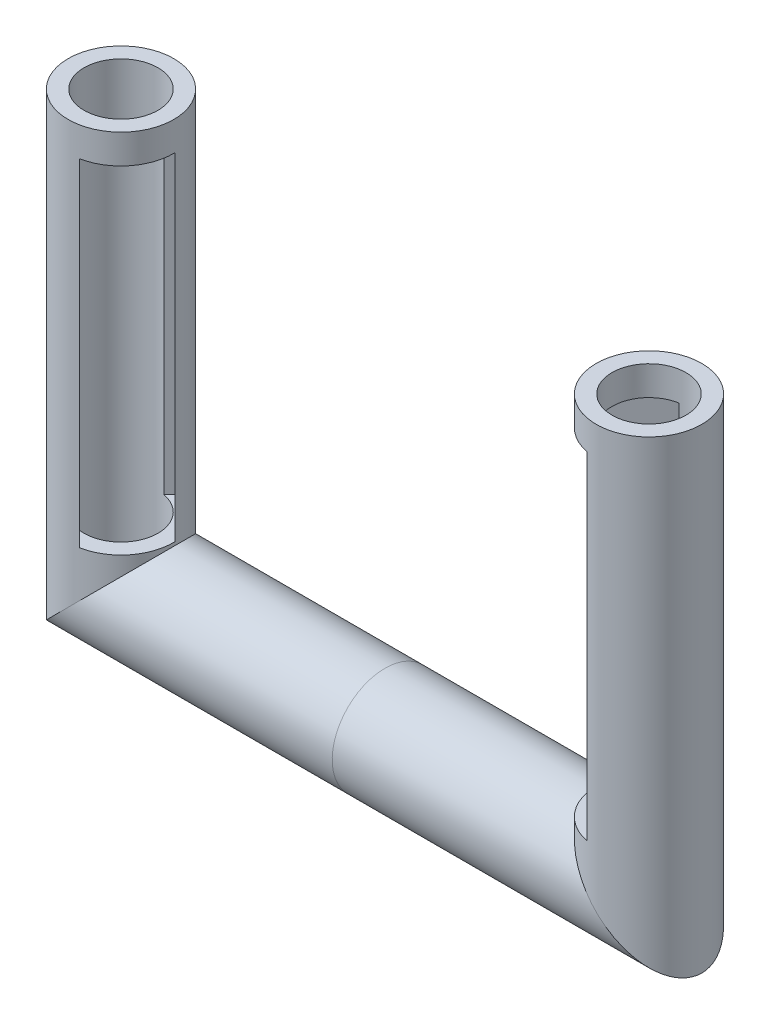
ISO-10303-21;
HEADER;
FILE_DESCRIPTION(('STEP AP214'),'2;1');
FILE_NAME('part.step','',(''),(''),'','','');
FILE_SCHEMA(('AUTOMOTIVE_DESIGN { 1 0 10303 214 1 1 1 1 }'));
ENDSEC;
DATA;
#1=APPLICATION_CONTEXT('core data for automotive mechanical design processes');
#2=APPLICATION_PROTOCOL_DEFINITION('international standard','automotive_design',2000,#1);
#3=PRODUCT_CONTEXT('',#1,'mechanical');
#4=PRODUCT('Part','Part','',(#3));
#5=PRODUCT_RELATED_PRODUCT_CATEGORY('part','',(#4));
#6=PRODUCT_DEFINITION_FORMATION('','',#4);
#7=PRODUCT_DEFINITION_CONTEXT('part definition',#1,'design');
#8=PRODUCT_DEFINITION('design','',#6,#7);
#9=PRODUCT_DEFINITION_SHAPE('','',#8);
#10=(LENGTH_UNIT() NAMED_UNIT(*) SI_UNIT(.MILLI.,.METRE.));
#11=(NAMED_UNIT(*) PLANE_ANGLE_UNIT() SI_UNIT($,.RADIAN.));
#12=(NAMED_UNIT(*) SI_UNIT($,.STERADIAN.) SOLID_ANGLE_UNIT());
#13=UNCERTAINTY_MEASURE_WITH_UNIT(LENGTH_MEASURE(1.E-05),#10,'distance_accuracy_value','');
#14=(GEOMETRIC_REPRESENTATION_CONTEXT(3) GLOBAL_UNCERTAINTY_ASSIGNED_CONTEXT((#13)) GLOBAL_UNIT_ASSIGNED_CONTEXT((#10,
#11,#12)) REPRESENTATION_CONTEXT('',''));
#15=CARTESIAN_POINT('',(0.,0.,0.));
#16=DIRECTION('',(0.,0.,1.));
#17=DIRECTION('',(1.,0.,0.));
#18=AXIS2_PLACEMENT_3D('',#15,#16,#17);
#19=CARTESIAN_POINT('',(25.,0.,0.));
#20=DIRECTION('',(0.,-1.,0.));
#21=DIRECTION('',(0.,0.,-1.));
#22=AXIS2_PLACEMENT_3D('',#19,#20,#21);
#23=CYLINDRICAL_SURFACE('',#22,5.);
#24=CARTESIAN_POINT('',(25.,0.,0.));
#25=DIRECTION('',(0.,-1.,0.));
#26=DIRECTION('',(0.,0.,-1.));
#27=AXIS2_PLACEMENT_3D('',#24,#25,#26);
#28=CIRCLE('',#27,5.);
#29=CARTESIAN_POINT('',(25.,0.,-5.));
#30=VERTEX_POINT('',#29);
#31=EDGE_CURVE('E207',#30,#30,#28,.T.);
#32=ORIENTED_EDGE('',*,*,#31,.T.);
#33=EDGE_LOOP('',(#32));
#34=FACE_BOUND('',#33,.T.);
#35=CARTESIAN_POINT('',(25.,-40.,0.));
#36=DIRECTION('',(-0.707106781186547,-0.707106781186547,0.));
#37=DIRECTION('',(0.707106781186548,-0.707106781186548,0.));
#38=AXIS2_PLACEMENT_3D('',#35,#36,#37);
#39=ELLIPSE('',#38,7.07106781186548,5.);
#40=CARTESIAN_POINT('',(30.,-45.,0.));
#41=VERTEX_POINT('',#40);
#42=EDGE_CURVE('E210',#41,#41,#39,.F.);
#43=ORIENTED_EDGE('',*,*,#42,.T.);
#44=EDGE_LOOP('',(#43));
#45=FACE_BOUND('',#44,.T.);
#46=DIRECTION('',(0.,-1.,0.));
#47=VECTOR('',#46,1.);
#48=CARTESIAN_POINT('',(24.0147215132596,0.,4.9019614751206));
#49=LINE('',#48,#47);
#50=CARTESIAN_POINT('',(24.0147215132596,-2.77855808400567,4.9019614751206));
#51=VERTEX_POINT('',#50);
#52=CARTESIAN_POINT('',(24.0147215132596,-34.6836136026809,4.9019614751206));
#53=VERTEX_POINT('',#52);
#54=EDGE_CURVE('E171',#51,#53,#49,.T.);
#55=ORIENTED_EDGE('',*,*,#54,.T.);
#56=CARTESIAN_POINT('',(25.,-34.6836136026809,0.));
#57=DIRECTION('',(0.,1.,0.));
#58=DIRECTION('',(0.,0.,1.));
#59=AXIS2_PLACEMENT_3D('',#56,#57,#58);
#60=CIRCLE('',#59,5.);
#61=CARTESIAN_POINT('',(20.0016396636706,-34.6836136026809,-0.128038854295883));
#62=VERTEX_POINT('',#61);
#63=EDGE_CURVE('E165',#53,#62,#60,.F.);
#64=ORIENTED_EDGE('',*,*,#63,.T.);
#65=DIRECTION('',(0.,-1.,0.));
#66=VECTOR('',#65,1.);
#67=CARTESIAN_POINT('',(20.0016396636706,0.,-0.128038854295886));
#68=LINE('',#67,#66);
#69=CARTESIAN_POINT('',(20.0016396636706,-2.77855808400567,-0.128038854295886));
#70=VERTEX_POINT('',#69);
#71=EDGE_CURVE('E12',#62,#70,#68,.F.);
#72=ORIENTED_EDGE('',*,*,#71,.T.);
#73=CARTESIAN_POINT('',(25.,-2.77855808400567,0.));
#74=DIRECTION('',(0.,-1.,0.));
#75=DIRECTION('',(0.,0.,-1.));
#76=AXIS2_PLACEMENT_3D('',#73,#74,#75);
#77=CIRCLE('',#76,5.);
#78=EDGE_CURVE('E155',#70,#51,#77,.F.);
#79=ORIENTED_EDGE('',*,*,#78,.T.);
#80=EDGE_LOOP('',(#55,#64,#72,#79));
#81=FACE_BOUND('',#80,.T.);
#82=ADVANCED_FACE('F53',(#34,#45,#81),#23,.T.);
#83=CARTESIAN_POINT('',(25.,-45.,0.));
#84=DIRECTION('',(0.,1.,0.));
#85=DIRECTION('',(-1.,0.,0.));
#86=AXIS2_PLACEMENT_3D('',#83,#84,#85);
#87=CYLINDRICAL_SURFACE('',#86,3.5);
#88=CARTESIAN_POINT('',(25.,0.,0.));
#89=DIRECTION('',(0.,1.,0.));
#90=DIRECTION('',(-1.,0.,0.));
#91=AXIS2_PLACEMENT_3D('',#88,#89,#90);
#92=CIRCLE('',#91,3.5);
#93=CARTESIAN_POINT('',(21.5,0.,0.));
#94=VERTEX_POINT('',#93);
#95=EDGE_CURVE('E200',#94,#94,#92,.T.);
#96=ORIENTED_EDGE('',*,*,#95,.T.);
#97=EDGE_LOOP('',(#96));
#98=FACE_BOUND('',#97,.T.);
#99=CARTESIAN_POINT('',(21.5,-45.,0.));
#100=CARTESIAN_POINT('',(21.4999995512338,-45.000000426217,-0.0870043522183524));
#101=CARTESIAN_POINT('',(21.5032484669496,-44.9977244704508,-0.174003012834708));
#102=CARTESIAN_POINT('',(21.5161907840674,-44.9886777030169,-0.347314194586727));
#103=CARTESIAN_POINT('',(21.5258864338965,-44.9819053231328,-0.433626465698281));
#104=CARTESIAN_POINT('',(21.5515713311856,-44.964028066774,-0.604838270775727));
#105=CARTESIAN_POINT('',(21.5675594869656,-44.952923941812,-0.689738047132314));
#106=CARTESIAN_POINT('',(21.6055872367174,-44.9266471854865,-0.857541615637309));
#107=CARTESIAN_POINT('',(21.6276294204598,-44.911472813032,-0.940444537032612));
#108=CARTESIAN_POINT('',(21.7021474691299,-44.8605038471595,-1.18445169780014));
#109=CARTESIAN_POINT('',(21.7631741569996,-44.8191497819812,-1.34188511202347));
#110=CARTESIAN_POINT('',(21.9053220822461,-44.7248504210069,-1.64342226800416));
#111=CARTESIAN_POINT('',(21.9864462520317,-44.6719034338271,-1.78752406033636));
#112=CARTESIAN_POINT('',(22.174207793629,-44.5529499967267,-2.07281883599129));
#113=CARTESIAN_POINT('',(22.2824657229564,-44.4862031325513,-2.21263077144972));
#114=CARTESIAN_POINT('',(22.5174359567967,-44.3478798670341,-2.47340994772193));
#115=CARTESIAN_POINT('',(22.6441758816401,-44.2762963250093,-2.59434841313184));
#116=CARTESIAN_POINT('',(22.8586794554901,-44.1630190643741,-2.77043321825859));
#117=CARTESIAN_POINT('',(22.9410183065317,-44.1211481424898,-2.83217300660939));
#118=CARTESIAN_POINT('',(23.1112753935954,-44.0387774104055,-2.94845109279402));
#119=CARTESIAN_POINT('',(23.1991950684113,-43.9982779579452,-3.00298752227158));
#120=CARTESIAN_POINT('',(23.4708790990424,-43.8809184938185,-3.15511672851824));
#121=CARTESIAN_POINT('',(23.6629944002236,-43.8079594487069,-3.24158145123197));
#122=CARTESIAN_POINT('',(24.0033854941969,-43.704838124837,-3.3583150253545));
#123=CARTESIAN_POINT('',(24.146667143814,-43.6684243417377,-3.39769929206986));
#124=CARTESIAN_POINT('',(24.4400217225125,-43.6115102670573,-3.45814142842493));
#125=CARTESIAN_POINT('',(24.5900807464653,-43.5909788310104,-3.47923517471286));
#126=CARTESIAN_POINT('',(24.8939955145555,-43.5690614827563,-3.50172630314739));
#127=CARTESIAN_POINT('',(25.0478680235262,-43.567785357308,-3.50301074075767));
#128=CARTESIAN_POINT('',(25.3533930589766,-43.5849071692273,-3.48547905206289));
#129=CARTESIAN_POINT('',(25.5050439858859,-43.6033186380017,-3.46664910102171));
#130=CARTESIAN_POINT('',(25.7918279973207,-43.6549042274352,-3.41217455094726));
#131=CARTESIAN_POINT('',(25.9273906029598,-43.6870234934446,-3.37772210034564));
#132=CARTESIAN_POINT('',(26.1907872983941,-43.7619145236116,-3.29410841442847));
#133=CARTESIAN_POINT('',(26.3186150929751,-43.8046948234213,-3.24493538684719));
#134=CARTESIAN_POINT('',(26.631130358571,-43.9217035825872,-3.10362288773558));
#135=CARTESIAN_POINT('',(26.8100457001008,-44.0005824158214,-3.00252401271627));
#136=CARTESIAN_POINT('',(27.1463248499358,-44.1635383519879,-2.77217358887505));
#137=CARTESIAN_POINT('',(27.3036437533954,-44.2476257738276,-2.64286478640501));
#138=CARTESIAN_POINT('',(27.5963414773844,-44.4131971999364,-2.35615009551438));
#139=CARTESIAN_POINT('',(27.731436868213,-44.4946383043019,-2.19842810008499));
#140=CARTESIAN_POINT('',(27.9734716247704,-44.6457107485664,-1.8579273762317));
#141=CARTESIAN_POINT('',(28.0804693567948,-44.7153664609856,-1.67520180814532));
#142=CARTESIAN_POINT('',(28.2413004145221,-44.8221663191169,-1.33103347938956));
#143=CARTESIAN_POINT('',(28.3016573477555,-44.8630935104224,-1.17381323782198));
#144=CARTESIAN_POINT('',(28.3995844313413,-44.9301001158466,-0.849391818622386));
#145=CARTESIAN_POINT('',(28.4371701020425,-44.9561896422184,-0.682197524634615));
#146=CARTESIAN_POINT('',(28.4875563004228,-44.9912640881203,-0.34160158230725));
#147=CARTESIAN_POINT('',(28.5002562644933,-45.0001796047066,-0.168177620339824));
#148=CARTESIAN_POINT('',(28.4997359535083,-44.9998149479061,0.178615477776586));
#149=CARTESIAN_POINT('',(28.4865168495561,-44.9905355966193,0.35198461604868));
#150=CARTESIAN_POINT('',(28.436722828532,-44.9558830824629,0.681878691052441));
#151=CARTESIAN_POINT('',(28.4017283336819,-44.9315996684455,0.838764541823677));
#152=CARTESIAN_POINT('',(28.3116266993323,-44.8698867392557,1.14387617411518));
#153=CARTESIAN_POINT('',(28.2565158080886,-44.8324547719037,1.29210033422852));
#154=CARTESIAN_POINT('',(28.1238414855766,-44.7440240710528,1.58733800015477));
#155=CARTESIAN_POINT('',(28.0449662780166,-44.6922533534956,1.7335252380801));
#156=CARTESIAN_POINT('',(27.8692594588007,-44.5801824682401,2.0110620530274));
#157=CARTESIAN_POINT('',(27.7724165610341,-44.519876945222,2.14240222019462));
#158=CARTESIAN_POINT('',(27.544939582541,-44.3837210249878,2.41023390883475));
#159=CARTESIAN_POINT('',(27.4113590265687,-44.3069755936636,2.54376778669948));
#160=CARTESIAN_POINT('',(27.1245427915274,-44.1531901996123,2.78779809474485));
#161=CARTESIAN_POINT('',(26.9712916916136,-44.0761500523102,2.8982762699034));
#162=CARTESIAN_POINT('',(26.6619774699135,-43.9363684782576,3.08500748122271));
#163=CARTESIAN_POINT('',(26.5075874323328,-43.8729642412897,3.1635242228457));
#164=CARTESIAN_POINT('',(26.1848447704579,-43.7591514944573,3.29796239328923));
#165=CARTESIAN_POINT('',(26.0165202138254,-43.7087176621485,3.35392797233398));
#166=CARTESIAN_POINT('',(25.7037654302806,-43.6369060024393,3.43149310287235));
#167=CARTESIAN_POINT('',(25.5613897573647,-43.6117142338086,3.45775440021168));
#168=CARTESIAN_POINT('',(25.2725865776338,-43.5782451738799,3.4923883051313));
#169=CARTESIAN_POINT('',(25.1261645726003,-43.5699459600266,3.50078409856961));
#170=CARTESIAN_POINT('',(24.8333598190396,-43.5715971669588,3.49909888334034));
#171=CARTESIAN_POINT('',(24.6869773288251,-43.5815695159632,3.48899567350594));
#172=CARTESIAN_POINT('',(24.398596490882,-43.6181648508262,3.45102053266417));
#173=CARTESIAN_POINT('',(24.2566048636507,-43.6448121516813,3.42312265276601));
#174=CARTESIAN_POINT('',(23.9409542040506,-43.7204664688759,3.34096227925005));
#175=CARTESIAN_POINT('',(23.7696829271032,-43.7736637811444,3.28147777563187));
#176=CARTESIAN_POINT('',(23.4419536090312,-43.8928197910686,3.13919427182786));
#177=CARTESIAN_POINT('',(23.28551909772,-43.9587982706025,3.0563590392188));
#178=CARTESIAN_POINT('',(22.984989333815,-44.0978200574564,2.8673990402521));
#179=CARTESIAN_POINT('',(22.8412761578677,-44.170994093468,2.76076710805705));
#180=CARTESIAN_POINT('',(22.5714511201449,-44.3168248864212,2.52666411670163));
#181=CARTESIAN_POINT('',(22.4453451056674,-44.38948146395,2.39918616499751));
#182=CARTESIAN_POINT('',(22.2602189874005,-44.5003763783351,2.18058687186094));
#183=CARTESIAN_POINT('',(22.1947947449777,-44.5405801571647,2.09580486228961));
#184=CARTESIAN_POINT('',(22.0714222057056,-44.617818614542,1.9196318449831));
#185=CARTESIAN_POINT('',(22.01347069167,-44.6548546545482,1.82824370796614));
#186=CARTESIAN_POINT('',(21.905733511123,-44.7247017057615,1.63930910148071));
#187=CARTESIAN_POINT('',(21.8559433608643,-44.7575150347271,1.54176605451268));
#188=CARTESIAN_POINT('',(21.7652534854647,-44.8179290632728,1.34109196004991));
#189=CARTESIAN_POINT('',(21.7243512497154,-44.8455312345817,1.23796250088363));
#190=CARTESIAN_POINT('',(21.6576343018685,-44.8909002837252,1.04286308882553));
#191=CARTESIAN_POINT('',(21.6304752564016,-44.9095222359585,0.951550304699071));
#192=CARTESIAN_POINT('',(21.5835582820308,-44.941840147897,0.766197984405038));
#193=CARTESIAN_POINT('',(21.5637987278105,-44.9555371893447,0.672159051937778));
#194=CARTESIAN_POINT('',(21.532048628417,-44.9776055027644,0.482256943579388));
#195=CARTESIAN_POINT('',(21.5200502858608,-44.985982119803,0.386395698505662));
#196=CARTESIAN_POINT('',(21.5040265638622,-44.9971788925555,0.193687228275465));
#197=CARTESIAN_POINT('',(21.5000004994987,-44.9999995255996,0.0968400885386267));
#198=CARTESIAN_POINT('',(21.5,-45.,0.));
#199=B_SPLINE_CURVE_WITH_KNOTS('',3,(#99,#100,#101,#102,#103,#104,#105,#106,#107,#108,#109,#110,
#111,#112,#113,#114,#115,#116,#117,#118,#119,#120,#121,#122,#123,#124,#125,#126,#127,#128,#129,
#130,#131,#132,#133,#134,#135,#136,#137,#138,#139,#140,#141,#142,#143,#144,#145,#146,#147,#148,
#149,#150,#151,#152,#153,#154,#155,#156,#157,#158,#159,#160,#161,#162,#163,#164,#165,#166,#167,
#168,#169,#170,#171,#172,#173,#174,#175,#176,#177,#178,#179,#180,#181,#182,#183,#184,#185,#186,
#187,#188,#189,#190,#191,#192,#193,#194,#195,#196,#197,#198),.UNSPECIFIED.,.T.,.F.,(4,2,2,2,2,2,
2,2,2,2,2,2,2,2,2,2,2,2,2,2,2,2,2,2,2,2,2,2,2,2,2,2,2,2,2,2,2,2,2,2,2,2,2,2,2,2,2,2,2,4),(0.,
0.260913186666066,0.52191741977439,0.782876391488196,1.04394716964421,1.56298190958995,
2.08209242616793,2.64705237592499,3.21286544833364,3.54582584040706,3.87887242451092,
4.54318175364801,5.00048193722639,5.4568830893327,5.91588549736315,6.37520358351763,
6.80419814677737,7.23353729006888,7.8904312594482,8.54867104526662,9.21474554480325,
9.87942528554155,10.3971938189047,10.9146090554214,11.4341108995647,11.953589271558,
12.439168070614,12.9248374772987,13.4448388395999,13.965167944917,14.574447250411,
15.1842071553651,15.7356049750207,16.2859179716953,16.724907060709,17.1633260811637,
17.6022716053507,18.0418586851689,18.605647020095,19.1703150249751,19.7484161780972,
20.3267088629478,20.6694660014279,21.0120750786385,21.3544952953889,21.6968186610904,
21.9876091670431,22.2783357626328,22.5687698211746,22.8591789266206),.UNSPECIFIED.);
#200=CARTESIAN_POINT('',(21.5,-45.,0.));
#201=VERTEX_POINT('',#200);
#202=EDGE_CURVE('E229',#201,#201,#199,.T.);
#203=ORIENTED_EDGE('',*,*,#202,.T.);
#204=EDGE_LOOP('',(#203));
#205=FACE_BOUND('',#204,.T.);
#206=CARTESIAN_POINT('',(25.,-2.77855808400567,0.));
#207=DIRECTION('',(0.,-1.,0.));
#208=DIRECTION('',(0.,0.,-1.));
#209=AXIS2_PLACEMENT_3D('',#206,#207,#208);
#210=CIRCLE('',#209,3.5);
#211=CARTESIAN_POINT('',(24.3832039612141,-2.77855808400567,-3.44522316353209));
#212=VERTEX_POINT('',#211);
#213=CARTESIAN_POINT('',(25.4451004056211,-2.77855808400567,3.47158258275904));
#214=VERTEX_POINT('',#213);
#215=EDGE_CURVE('E61',#212,#214,#210,.F.);
#216=ORIENTED_EDGE('',*,*,#215,.F.);
#217=DIRECTION('',(0.,1.,0.));
#218=VECTOR('',#217,1.);
#219=CARTESIAN_POINT('',(24.3832039612141,-45.,-3.44522316353209));
#220=LINE('',#219,#218);
#221=CARTESIAN_POINT('',(24.3832039612141,-34.6836136026809,-3.44522316353209));
#222=VERTEX_POINT('',#221);
#223=EDGE_CURVE('E159',#212,#222,#220,.F.);
#224=ORIENTED_EDGE('',*,*,#223,.T.);
#225=CARTESIAN_POINT('',(25.,-34.6836136026809,0.));
#226=DIRECTION('',(0.,1.,0.));
#227=DIRECTION('',(0.,0.,1.));
#228=AXIS2_PLACEMENT_3D('',#225,#226,#227);
#229=CIRCLE('',#228,3.5);
#230=CARTESIAN_POINT('',(25.4451004056211,-34.6836136026809,3.47158258275904));
#231=VERTEX_POINT('',#230);
#232=EDGE_CURVE('E300',#231,#222,#229,.F.);
#233=ORIENTED_EDGE('',*,*,#232,.F.);
#234=DIRECTION('',(0.,1.,0.));
#235=VECTOR('',#234,1.);
#236=CARTESIAN_POINT('',(25.4451004056211,-45.,3.47158258275904));
#237=LINE('',#236,#235);
#238=EDGE_CURVE('E299',#214,#231,#237,.F.);
#239=ORIENTED_EDGE('',*,*,#238,.F.);
#240=EDGE_LOOP('',(#216,#224,#233,#239));
#241=FACE_BOUND('',#240,.T.);
#242=ADVANCED_FACE('F246',(#98,#205,#241),#87,.F.);
#243=CARTESIAN_POINT('',(-25.,0.,0.));
#244=DIRECTION('',(0.,1.,0.));
#245=DIRECTION('',(0.,0.,-1.));
#246=AXIS2_PLACEMENT_3D('',#243,#244,#245);
#247=PLANE('',#246);
#248=CARTESIAN_POINT('',(-25.,0.,0.));
#249=DIRECTION('',(0.,1.,0.));
#250=DIRECTION('',(-1.,0.,0.));
#251=AXIS2_PLACEMENT_3D('',#248,#249,#250);
#252=CIRCLE('',#251,3.5);
#253=CARTESIAN_POINT('',(-28.5,0.,0.));
#254=VERTEX_POINT('',#253);
#255=EDGE_CURVE('E201',#254,#254,#252,.T.);
#256=ORIENTED_EDGE('',*,*,#255,.F.);
#257=EDGE_LOOP('',(#256));
#258=FACE_BOUND('',#257,.T.);
#259=CARTESIAN_POINT('',(-25.,0.,0.));
#260=DIRECTION('',(0.,1.,0.));
#261=DIRECTION('',(0.,0.,-1.));
#262=AXIS2_PLACEMENT_3D('',#259,#260,#261);
#263=CIRCLE('',#262,5.);
#264=CARTESIAN_POINT('',(-25.,0.,-5.));
#265=VERTEX_POINT('',#264);
#266=EDGE_CURVE('E204',#265,#265,#263,.T.);
#267=ORIENTED_EDGE('',*,*,#266,.T.);
#268=EDGE_LOOP('',(#267));
#269=FACE_BOUND('',#268,.T.);
#270=ADVANCED_FACE('F55',(#258,#269),#247,.T.);
#271=CARTESIAN_POINT('',(25.,0.,0.));
#272=DIRECTION('',(0.,-1.,0.));
#273=DIRECTION('',(0.,0.,-1.));
#274=AXIS2_PLACEMENT_3D('',#271,#272,#273);
#275=PLANE('',#274);
#276=ORIENTED_EDGE('',*,*,#95,.F.);
#277=EDGE_LOOP('',(#276));
#278=FACE_BOUND('',#277,.T.);
#279=ORIENTED_EDGE('',*,*,#31,.F.);
#280=EDGE_LOOP('',(#279));
#281=FACE_BOUND('',#280,.T.);
#282=ADVANCED_FACE('F264',(#278,#281),#275,.F.);
#283=CARTESIAN_POINT('',(-25.,-51.1,0.));
#284=DIRECTION('',(0.,1.,0.));
#285=DIRECTION('',(0.,0.,1.));
#286=AXIS2_PLACEMENT_3D('',#283,#284,#285);
#287=CYLINDRICAL_SURFACE('',#286,5.);
#288=CARTESIAN_POINT('',(-25.,-34.6836136026809,0.));
#289=DIRECTION('',(0.,-1.,0.));
#290=DIRECTION('',(0.,0.,-1.));
#291=AXIS2_PLACEMENT_3D('',#288,#289,#290);
#292=CIRCLE('',#291,5.);
#293=CARTESIAN_POINT('',(-24.0147215132596,-34.6836136026809,4.9019614751206));
#294=VERTEX_POINT('',#293);
#295=CARTESIAN_POINT('',(-21.4644660940673,-34.6836136026809,3.53553390593273));
#296=VERTEX_POINT('',#295);
#297=EDGE_CURVE('E196',#294,#296,#292,.F.);
#298=ORIENTED_EDGE('',*,*,#297,.F.);
#299=DIRECTION('',(0.,1.,0.));
#300=VECTOR('',#299,1.);
#301=CARTESIAN_POINT('',(-24.0147215132596,-51.1,4.9019614751206));
#302=LINE('',#301,#300);
#303=CARTESIAN_POINT('',(-24.0147215132596,-2.77855808400567,4.9019614751206));
#304=VERTEX_POINT('',#303);
#305=EDGE_CURVE('E186',#304,#294,#302,.F.);
#306=ORIENTED_EDGE('',*,*,#305,.F.);
#307=CARTESIAN_POINT('',(-25.,-2.77855808400567,0.));
#308=DIRECTION('',(0.,1.,0.));
#309=DIRECTION('',(0.,0.,1.));
#310=AXIS2_PLACEMENT_3D('',#307,#308,#309);
#311=CIRCLE('',#310,5.);
#312=CARTESIAN_POINT('',(-21.4644660940673,-2.77855808400567,3.53553390593273));
#313=VERTEX_POINT('',#312);
#314=EDGE_CURVE('E68',#313,#304,#311,.F.);
#315=ORIENTED_EDGE('',*,*,#314,.F.);
#316=CARTESIAN_POINT('',(-20.0016396636706,-2.77855808400567,-0.128038854295875));
#317=VERTEX_POINT('',#316);
#318=EDGE_CURVE('E198',#317,#313,#311,.F.);
#319=ORIENTED_EDGE('',*,*,#318,.F.);
#320=DIRECTION('',(0.,1.,0.));
#321=VECTOR('',#320,1.);
#322=CARTESIAN_POINT('',(-20.0016396636706,-51.1,-0.128038854295872));
#323=LINE('',#322,#321);
#324=CARTESIAN_POINT('',(-20.0016396636706,-34.6836136026809,-0.128038854295875));
#325=VERTEX_POINT('',#324);
#326=EDGE_CURVE('E306',#325,#317,#323,.T.);
#327=ORIENTED_EDGE('',*,*,#326,.F.);
#328=EDGE_CURVE('E75',#296,#325,#292,.F.);
#329=ORIENTED_EDGE('',*,*,#328,.F.);
#330=EDGE_LOOP('',(#298,#306,#315,#319,#327,#329));
#331=FACE_BOUND('',#330,.T.);
#332=CARTESIAN_POINT('',(-25.,-40.,0.));
#333=DIRECTION('',(-0.707106781186548,0.707106781186548,0.));
#334=DIRECTION('',(-0.707106781186548,-0.707106781186548,0.));
#335=AXIS2_PLACEMENT_3D('',#332,#333,#334);
#336=ELLIPSE('',#335,7.07106781186548,5.);
#337=CARTESIAN_POINT('',(-30.,-45.,0.));
#338=VERTEX_POINT('',#337);
#339=EDGE_CURVE('E217',#338,#338,#336,.F.);
#340=ORIENTED_EDGE('',*,*,#339,.F.);
#341=EDGE_LOOP('',(#340));
#342=FACE_BOUND('',#341,.T.);
#343=ORIENTED_EDGE('',*,*,#266,.F.);
#344=EDGE_LOOP('',(#343));
#345=FACE_BOUND('',#344,.T.);
#346=ADVANCED_FACE('F256',(#331,#342,#345),#287,.T.);
#347=CARTESIAN_POINT('',(36.1,-40.,0.));
#348=DIRECTION('',(-1.,0.,0.));
#349=DIRECTION('',(0.,0.,1.));
#350=AXIS2_PLACEMENT_3D('',#347,#348,#349);
#351=CYLINDRICAL_SURFACE('',#350,5.);
#352=ORIENTED_EDGE('',*,*,#202,.F.);
#353=EDGE_LOOP('',(#352));
#354=FACE_BOUND('',#353,.T.);
#355=ORIENTED_EDGE('',*,*,#42,.F.);
#356=EDGE_LOOP('',(#355));
#357=FACE_BOUND('',#356,.T.);
#358=CARTESIAN_POINT('',(0.,-40.,0.));
#359=DIRECTION('',(-1.,0.,0.));
#360=DIRECTION('',(0.,0.,-1.));
#361=AXIS2_PLACEMENT_3D('',#358,#359,#360);
#362=CIRCLE('',#361,5.);
#363=CARTESIAN_POINT('',(0.,-40.,-5.));
#364=VERTEX_POINT('',#363);
#365=EDGE_CURVE('E211',#364,#364,#362,.T.);
#366=ORIENTED_EDGE('',*,*,#365,.F.);
#367=EDGE_LOOP('',(#366));
#368=FACE_BOUND('',#367,.T.);
#369=ADVANCED_FACE('F253',(#354,#357,#368),#351,.T.);
#370=CARTESIAN_POINT('',(0.,-40.,0.));
#371=DIRECTION('',(-1.,0.,0.));
#372=DIRECTION('',(0.,0.,1.));
#373=AXIS2_PLACEMENT_3D('',#370,#371,#372);
#374=CYLINDRICAL_SURFACE('',#373,5.);
#375=CARTESIAN_POINT('',(-28.5,-45.,0.));
#376=CARTESIAN_POINT('',(-28.5000004487662,-45.000000426217,-0.0870043522183524));
#377=CARTESIAN_POINT('',(-28.4967515330504,-44.9977244704508,-0.174003012834708));
#378=CARTESIAN_POINT('',(-28.4838092159326,-44.9886777030169,-0.347314194586727));
#379=CARTESIAN_POINT('',(-28.4741135661035,-44.9819053231328,-0.433626465698281));
#380=CARTESIAN_POINT('',(-28.4484286688144,-44.964028066774,-0.604838270775727));
#381=CARTESIAN_POINT('',(-28.4324405130344,-44.952923941812,-0.689738047132314));
#382=CARTESIAN_POINT('',(-28.3944127632826,-44.9266471854865,-0.857541615637309));
#383=CARTESIAN_POINT('',(-28.3723705795402,-44.911472813032,-0.940444537032612));
#384=CARTESIAN_POINT('',(-28.2978525308701,-44.8605038471595,-1.18445169780014));
#385=CARTESIAN_POINT('',(-28.2368258430004,-44.8191497819812,-1.34188511202347));
#386=CARTESIAN_POINT('',(-28.0946779177539,-44.7248504210069,-1.64342226800416));
#387=CARTESIAN_POINT('',(-28.0135537479683,-44.6719034338271,-1.78752406033636));
#388=CARTESIAN_POINT('',(-27.825792206371,-44.5529499967267,-2.07281883599129));
#389=CARTESIAN_POINT('',(-27.7175342770436,-44.4862031325513,-2.21263077144972));
#390=CARTESIAN_POINT('',(-27.4825640432033,-44.3478798670341,-2.47340994772192));
#391=CARTESIAN_POINT('',(-27.3558241183599,-44.2762963250093,-2.59434841313184));
#392=CARTESIAN_POINT('',(-27.1413205445099,-44.1630190643741,-2.77043321825859));
#393=CARTESIAN_POINT('',(-27.0589816934683,-44.1211481424898,-2.83217300660939));
#394=CARTESIAN_POINT('',(-26.8887246064047,-44.0387774104055,-2.94845109279401));
#395=CARTESIAN_POINT('',(-26.8008049315887,-43.9982779579452,-3.00298752227157));
#396=CARTESIAN_POINT('',(-26.5291209009576,-43.8809184938185,-3.15511672851824));
#397=CARTESIAN_POINT('',(-26.3370055997764,-43.8079594487069,-3.24158145123197));
#398=CARTESIAN_POINT('',(-25.9966145058031,-43.704838124837,-3.3583150253545));
#399=CARTESIAN_POINT('',(-25.853332856186,-43.6684243417377,-3.39769929206986));
#400=CARTESIAN_POINT('',(-25.5599782774875,-43.6115102670573,-3.45814142842493));
#401=CARTESIAN_POINT('',(-25.4099192535347,-43.5909788310104,-3.47923517471286));
#402=CARTESIAN_POINT('',(-25.1060044854445,-43.5690614827563,-3.50172630314739));
#403=CARTESIAN_POINT('',(-24.9521319764738,-43.567785357308,-3.50301074075767));
#404=CARTESIAN_POINT('',(-24.6466069410234,-43.5849071692273,-3.48547905206289));
#405=CARTESIAN_POINT('',(-24.4949560141141,-43.6033186380017,-3.46664910102171));
#406=CARTESIAN_POINT('',(-24.2081720026793,-43.6549042274352,-3.41217455094726));
#407=CARTESIAN_POINT('',(-24.0726093970402,-43.6870234934446,-3.37772210034564));
#408=CARTESIAN_POINT('',(-23.8092127016059,-43.7619145236116,-3.29410841442847));
#409=CARTESIAN_POINT('',(-23.6813849070249,-43.8046948234214,-3.24493538684719));
#410=CARTESIAN_POINT('',(-23.368869641429,-43.9217035825872,-3.10362288773558));
#411=CARTESIAN_POINT('',(-23.1899542998992,-44.0005824158214,-3.00252401271627));
#412=CARTESIAN_POINT('',(-22.8536751500642,-44.1635383519879,-2.77217358887505));
#413=CARTESIAN_POINT('',(-22.6963562466046,-44.2476257738276,-2.64286478640501));
#414=CARTESIAN_POINT('',(-22.4036585226156,-44.4131971999364,-2.35615009551438));
#415=CARTESIAN_POINT('',(-22.268563131787,-44.4946383043019,-2.19842810008499));
#416=CARTESIAN_POINT('',(-22.0265283752296,-44.6457107485664,-1.8579273762317));
#417=CARTESIAN_POINT('',(-21.9195306432053,-44.7153664609856,-1.67520180814532));
#418=CARTESIAN_POINT('',(-21.7586995854779,-44.8221663191169,-1.33103347938956));
#419=CARTESIAN_POINT('',(-21.6983426522445,-44.8630935104224,-1.17381323782198));
#420=CARTESIAN_POINT('',(-21.6004155686587,-44.9301001158466,-0.849391818622386));
#421=CARTESIAN_POINT('',(-21.5628298979575,-44.9561896422184,-0.682197524634615));
#422=CARTESIAN_POINT('',(-21.5124436995772,-44.9912640881203,-0.34160158230725));
#423=CARTESIAN_POINT('',(-21.4997437355067,-45.0001796047066,-0.168177620339824));
#424=CARTESIAN_POINT('',(-21.5002640464917,-44.9998149479061,0.178615477776586));
#425=CARTESIAN_POINT('',(-21.5134831504439,-44.9905355966193,0.35198461604868));
#426=CARTESIAN_POINT('',(-21.563277171468,-44.9558830824629,0.681878691052441));
#427=CARTESIAN_POINT('',(-21.5982716663181,-44.9315996684455,0.838764541823677));
#428=CARTESIAN_POINT('',(-21.6883733006677,-44.8698867392557,1.14387617411518));
#429=CARTESIAN_POINT('',(-21.7434841919114,-44.8324547719037,1.29210033422852));
#430=CARTESIAN_POINT('',(-21.8761585144234,-44.7440240710528,1.58733800015478));
#431=CARTESIAN_POINT('',(-21.9550337219834,-44.6922533534956,1.7335252380801));
#432=CARTESIAN_POINT('',(-22.1307405411994,-44.5801824682401,2.0110620530274));
#433=CARTESIAN_POINT('',(-22.227583438966,-44.519876945222,2.14240222019462));
#434=CARTESIAN_POINT('',(-22.455060417459,-44.3837210249878,2.41023390883475));
#435=CARTESIAN_POINT('',(-22.5886409734313,-44.3069755936636,2.54376778669948));
#436=CARTESIAN_POINT('',(-22.8754572084726,-44.1531901996123,2.78779809474485));
#437=CARTESIAN_POINT('',(-23.0287083083864,-44.0761500523102,2.8982762699034));
#438=CARTESIAN_POINT('',(-23.3380225300865,-43.9363684782576,3.08500748122271));
#439=CARTESIAN_POINT('',(-23.4924125676672,-43.8729642412897,3.1635242228457));
#440=CARTESIAN_POINT('',(-23.8151552295421,-43.7591514944573,3.29796239328923));
#441=CARTESIAN_POINT('',(-23.9834797861746,-43.7087176621485,3.35392797233398));
#442=CARTESIAN_POINT('',(-24.2962345697194,-43.6369060024393,3.43149310287235));
#443=CARTESIAN_POINT('',(-24.4386102426353,-43.6117142338086,3.45775440021168));
#444=CARTESIAN_POINT('',(-24.7274134223662,-43.5782451738799,3.4923883051313));
#445=CARTESIAN_POINT('',(-24.8738354273997,-43.5699459600266,3.50078409856961));
#446=CARTESIAN_POINT('',(-25.1666401809604,-43.5715971669588,3.49909888334034));
#447=CARTESIAN_POINT('',(-25.3130226711749,-43.5815695159632,3.48899567350594));
#448=CARTESIAN_POINT('',(-25.601403509118,-43.6181648508262,3.45102053266417));
#449=CARTESIAN_POINT('',(-25.7433951363493,-43.6448121516813,3.42312265276601));
#450=CARTESIAN_POINT('',(-26.0590457959494,-43.7204664688759,3.34096227925005));
#451=CARTESIAN_POINT('',(-26.2303170728968,-43.7736637811444,3.28147777563187));
#452=CARTESIAN_POINT('',(-26.5580463909688,-43.8928197910686,3.13919427182786));
#453=CARTESIAN_POINT('',(-26.71448090228,-43.9587982706025,3.0563590392188));
#454=CARTESIAN_POINT('',(-27.015010666185,-44.0978200574564,2.8673990402521));
#455=CARTESIAN_POINT('',(-27.1587238421323,-44.170994093468,2.76076710805705));
#456=CARTESIAN_POINT('',(-27.4285488798551,-44.3168248864212,2.52666411670163));
#457=CARTESIAN_POINT('',(-27.5546548943326,-44.38948146395,2.39918616499751));
#458=CARTESIAN_POINT('',(-27.7397810125995,-44.5003763783351,2.18058687186094));
#459=CARTESIAN_POINT('',(-27.8052052550223,-44.5405801571647,2.09580486228961));
#460=CARTESIAN_POINT('',(-27.9285777942944,-44.617818614542,1.9196318449831));
#461=CARTESIAN_POINT('',(-27.98652930833,-44.6548546545482,1.82824370796614));
#462=CARTESIAN_POINT('',(-28.094266488877,-44.7247017057615,1.63930910148071));
#463=CARTESIAN_POINT('',(-28.1440566391357,-44.7575150347271,1.54176605451268));
#464=CARTESIAN_POINT('',(-28.2347465145354,-44.8179290632728,1.34109196004991));
#465=CARTESIAN_POINT('',(-28.2756487502846,-44.8455312345817,1.23796250088363));
#466=CARTESIAN_POINT('',(-28.3423656981315,-44.8909002837252,1.04286308882553));
#467=CARTESIAN_POINT('',(-28.3695247435984,-44.9095222359585,0.951550304699071));
#468=CARTESIAN_POINT('',(-28.4164417179692,-44.941840147897,0.766197984405038));
#469=CARTESIAN_POINT('',(-28.4362012721895,-44.9555371893447,0.672159051937778));
#470=CARTESIAN_POINT('',(-28.467951371583,-44.9776055027644,0.482256943579388));
#471=CARTESIAN_POINT('',(-28.4799497141392,-44.985982119803,0.386395698505662));
#472=CARTESIAN_POINT('',(-28.4959734361378,-44.9971788925555,0.193687228275465));
#473=CARTESIAN_POINT('',(-28.4999995005013,-44.9999995255996,0.0968400885386267));
#474=CARTESIAN_POINT('',(-28.5,-45.,0.));
#475=B_SPLINE_CURVE_WITH_KNOTS('',3,(#375,#376,#377,#378,#379,#380,#381,#382,#383,#384,#385,
#386,#387,#388,#389,#390,#391,#392,#393,#394,#395,#396,#397,#398,#399,#400,#401,#402,#403,#404,
#405,#406,#407,#408,#409,#410,#411,#412,#413,#414,#415,#416,#417,#418,#419,#420,#421,#422,#423,
#424,#425,#426,#427,#428,#429,#430,#431,#432,#433,#434,#435,#436,#437,#438,#439,#440,#441,#442,
#443,#444,#445,#446,#447,#448,#449,#450,#451,#452,#453,#454,#455,#456,#457,#458,#459,#460,#461,
#462,#463,#464,#465,#466,#467,#468,#469,#470,#471,#472,#473,#474),.UNSPECIFIED.,.T.,.F.,(4,2,2,
2,2,2,2,2,2,2,2,2,2,2,2,2,2,2,2,2,2,2,2,2,2,2,2,2,2,2,2,2,2,2,2,2,2,2,2,2,2,2,2,2,2,2,2,2,2,4),
(0.,0.260913186666066,0.52191741977439,0.782876391488196,1.04394716964421,1.56298190958995,
2.08209242616793,2.64705237592498,3.21286544833364,3.54582584040706,3.87887242451091,
4.54318175364801,5.00048193722639,5.4568830893327,5.91588549736315,6.37520358351763,
6.80419814677738,7.23353729006888,7.8904312594482,8.54867104526662,9.21474554480325,
9.87942528554155,10.3971938189047,10.9146090554214,11.4341108995647,11.953589271558,
12.439168070614,12.9248374772987,13.4448388395999,13.965167944917,14.574447250411,
15.1842071553651,15.7356049750207,16.2859179716953,16.724907060709,17.1633260811637,
17.6022716053507,18.0418586851689,18.605647020095,19.1703150249751,19.7484161780972,
20.3267088629478,20.6694660014279,21.0120750786385,21.3544952953889,21.6968186610904,
21.9876091670431,22.2783357626328,22.5687698211746,22.8591789266206),.UNSPECIFIED.);
#476=CARTESIAN_POINT('',(-28.5,-45.,0.));
#477=VERTEX_POINT('',#476);
#478=EDGE_CURVE('E214',#477,#477,#475,.T.);
#479=ORIENTED_EDGE('',*,*,#478,.F.);
#480=EDGE_LOOP('',(#479));
#481=FACE_BOUND('',#480,.T.);
#482=ORIENTED_EDGE('',*,*,#365,.T.);
#483=EDGE_LOOP('',(#482));
#484=FACE_BOUND('',#483,.T.);
#485=ORIENTED_EDGE('',*,*,#339,.T.);
#486=EDGE_LOOP('',(#485));
#487=FACE_BOUND('',#486,.T.);
#488=ADVANCED_FACE('F236',(#481,#484,#487),#374,.T.);
#489=CARTESIAN_POINT('',(-25.,-45.,0.));
#490=DIRECTION('',(0.,1.,0.));
#491=DIRECTION('',(-1.,0.,0.));
#492=AXIS2_PLACEMENT_3D('',#489,#490,#491);
#493=CYLINDRICAL_SURFACE('',#492,3.5);
#494=CARTESIAN_POINT('',(-25.,-2.77855808400567,0.));
#495=DIRECTION('',(0.,1.,0.));
#496=DIRECTION('',(0.,0.,1.));
#497=AXIS2_PLACEMENT_3D('',#494,#495,#496);
#498=CIRCLE('',#497,3.5);
#499=CARTESIAN_POINT('',(-24.3832039612141,-2.77855808400567,-3.44522316353209));
#500=VERTEX_POINT('',#499);
#501=CARTESIAN_POINT('',(-25.4451004056211,-2.77855808400567,3.47158258275904));
#502=VERTEX_POINT('',#501);
#503=EDGE_CURVE('E311',#500,#502,#498,.F.);
#504=ORIENTED_EDGE('',*,*,#503,.T.);
#505=DIRECTION('',(0.,1.,0.));
#506=VECTOR('',#505,1.);
#507=CARTESIAN_POINT('',(-25.4451004056211,-45.,3.47158258275904));
#508=LINE('',#507,#506);
#509=CARTESIAN_POINT('',(-25.4451004056211,-34.6836136026809,3.47158258275904));
#510=VERTEX_POINT('',#509);
#511=EDGE_CURVE('E308',#502,#510,#508,.F.);
#512=ORIENTED_EDGE('',*,*,#511,.T.);
#513=CARTESIAN_POINT('',(-25.,-34.6836136026809,0.));
#514=DIRECTION('',(0.,-1.,0.));
#515=DIRECTION('',(0.,0.,-1.));
#516=AXIS2_PLACEMENT_3D('',#513,#514,#515);
#517=CIRCLE('',#516,3.5);
#518=CARTESIAN_POINT('',(-24.3832039612141,-34.6836136026809,-3.44522316353209));
#519=VERTEX_POINT('',#518);
#520=EDGE_CURVE('E314',#510,#519,#517,.F.);
#521=ORIENTED_EDGE('',*,*,#520,.T.);
#522=DIRECTION('',(0.,1.,0.));
#523=VECTOR('',#522,1.);
#524=CARTESIAN_POINT('',(-24.3832039612141,-45.,-3.44522316353209));
#525=LINE('',#524,#523);
#526=EDGE_CURVE('E316',#519,#500,#525,.T.);
#527=ORIENTED_EDGE('',*,*,#526,.T.);
#528=EDGE_LOOP('',(#504,#512,#521,#527));
#529=FACE_BOUND('',#528,.T.);
#530=ORIENTED_EDGE('',*,*,#478,.T.);
#531=EDGE_LOOP('',(#530));
#532=FACE_BOUND('',#531,.T.);
#533=ORIENTED_EDGE('',*,*,#255,.T.);
#534=EDGE_LOOP('',(#533));
#535=FACE_BOUND('',#534,.T.);
#536=ADVANCED_FACE('F239',(#529,#532,#535),#493,.F.);
#537=CARTESIAN_POINT('',(-23.8510139670605,-2.77855808400567,-3.97741315768572));
#538=DIRECTION('',(0.,1.,0.));
#539=DIRECTION('',(0.,0.,1.));
#540=AXIS2_PLACEMENT_3D('',#537,#538,#539);
#541=PLANE('',#540);
#542=ORIENTED_EDGE('',*,*,#318,.T.);
#543=ORIENTED_EDGE('',*,*,#314,.T.);
#544=DIRECTION('',(0.707106781186549,0.,0.707106781186546));
#545=VECTOR('',#544,1.);
#546=CARTESIAN_POINT('',(-28.3725550565632,-2.77855808400567,0.544127931816998));
#547=LINE('',#546,#545);
#548=EDGE_CURVE('E182',#502,#304,#547,.T.);
#549=ORIENTED_EDGE('',*,*,#548,.F.);
#550=ORIENTED_EDGE('',*,*,#503,.F.);
#551=DIRECTION('',(-0.707106781186546,0.,0.707106781186549));
#552=VECTOR('',#551,1.);
#553=CARTESIAN_POINT('',(-23.8510139670605,-2.77855808400567,-3.97741315768572));
#554=LINE('',#553,#552);
#555=CARTESIAN_POINT('',(-23.8510139670605,-2.77855808400567,-3.97741315768572));
#556=VERTEX_POINT('',#555);
#557=EDGE_CURVE('E175',#556,#500,#554,.T.);
#558=ORIENTED_EDGE('',*,*,#557,.F.);
#559=DIRECTION('',(0.707106781186549,0.,0.707106781186546));
#560=VECTOR('',#559,1.);
#561=CARTESIAN_POINT('',(-23.8510139670605,-2.77855808400567,-3.97741315768572));
#562=LINE('',#561,#560);
#563=EDGE_CURVE('E183',#556,#317,#562,.T.);
#564=ORIENTED_EDGE('',*,*,#563,.T.);
#565=EDGE_LOOP('',(#542,#543,#549,#550,#558,#564));
#566=FACE_BOUND('',#565,.T.);
#567=ADVANCED_FACE('F243',(#566),#541,.F.);
#568=CARTESIAN_POINT('',(-23.8510139670605,-34.6836136026809,-3.97741315768572));
#569=DIRECTION('',(0.,-1.,0.));
#570=DIRECTION('',(0.,0.,-1.));
#571=AXIS2_PLACEMENT_3D('',#568,#569,#570);
#572=PLANE('',#571);
#573=ORIENTED_EDGE('',*,*,#297,.T.);
#574=ORIENTED_EDGE('',*,*,#328,.T.);
#575=DIRECTION('',(0.707106781186549,0.,0.707106781186546));
#576=VECTOR('',#575,1.);
#577=CARTESIAN_POINT('',(-23.8510139670605,-34.6836136026809,-3.97741315768572));
#578=LINE('',#577,#576);
#579=CARTESIAN_POINT('',(-23.8510139670605,-34.6836136026809,-3.97741315768572));
#580=VERTEX_POINT('',#579);
#581=EDGE_CURVE('E187',#580,#325,#578,.T.);
#582=ORIENTED_EDGE('',*,*,#581,.F.);
#583=DIRECTION('',(0.707106781186546,0.,-0.707106781186549));
#584=VECTOR('',#583,1.);
#585=CARTESIAN_POINT('',(-23.8510139670605,-34.6836136026809,-3.97741315768572));
#586=LINE('',#585,#584);
#587=EDGE_CURVE('E177',#519,#580,#586,.T.);
#588=ORIENTED_EDGE('',*,*,#587,.F.);
#589=ORIENTED_EDGE('',*,*,#520,.F.);
#590=DIRECTION('',(0.707106781186549,0.,0.707106781186546));
#591=VECTOR('',#590,1.);
#592=CARTESIAN_POINT('',(-28.3725550565632,-34.6836136026809,0.544127931816998));
#593=LINE('',#592,#591);
#594=EDGE_CURVE('E190',#510,#294,#593,.T.);
#595=ORIENTED_EDGE('',*,*,#594,.T.);
#596=EDGE_LOOP('',(#573,#574,#582,#588,#589,#595));
#597=FACE_BOUND('',#596,.T.);
#598=ADVANCED_FACE('F327',(#597),#572,.F.);
#599=CARTESIAN_POINT('',(-28.3725550565632,-34.6836136026809,0.544127931816998));
#600=DIRECTION('',(-0.707106781186546,0.,0.707106781186549));
#601=DIRECTION('',(0.707106781186549,0.,0.707106781186546));
#602=AXIS2_PLACEMENT_3D('',#599,#600,#601);
#603=PLANE('',#602);
#604=ORIENTED_EDGE('',*,*,#305,.T.);
#605=ORIENTED_EDGE('',*,*,#594,.F.);
#606=ORIENTED_EDGE('',*,*,#511,.F.);
#607=ORIENTED_EDGE('',*,*,#548,.T.);
#608=EDGE_LOOP('',(#604,#605,#606,#607));
#609=FACE_BOUND('',#608,.T.);
#610=ADVANCED_FACE('F335',(#609),#603,.F.);
#611=CARTESIAN_POINT('',(-13.9142135623731,0.,-13.9142135623731));
#612=DIRECTION('',(-0.707106781186549,0.,-0.707106781186546));
#613=DIRECTION('',(-0.707106781186546,0.,0.707106781186549));
#614=AXIS2_PLACEMENT_3D('',#611,#612,#613);
#615=PLANE('',#614);
#616=ORIENTED_EDGE('',*,*,#587,.T.);
#617=DIRECTION('',(0.,1.,0.));
#618=VECTOR('',#617,1.);
#619=CARTESIAN_POINT('',(-23.8510139670605,-34.6836136026809,-3.97741315768572));
#620=LINE('',#619,#618);
#621=EDGE_CURVE('E179',#580,#556,#620,.T.);
#622=ORIENTED_EDGE('',*,*,#621,.T.);
#623=ORIENTED_EDGE('',*,*,#557,.T.);
#624=ORIENTED_EDGE('',*,*,#526,.F.);
#625=EDGE_LOOP('',(#616,#622,#623,#624));
#626=FACE_BOUND('',#625,.T.);
#627=ADVANCED_FACE('F323',(#626),#615,.F.);
#628=CARTESIAN_POINT('',(-23.8510139670605,-34.6836136026809,-3.97741315768572));
#629=DIRECTION('',(0.707106781186546,0.,-0.707106781186549));
#630=DIRECTION('',(-0.707106781186549,0.,-0.707106781186546));
#631=AXIS2_PLACEMENT_3D('',#628,#629,#630);
#632=PLANE('',#631);
#633=ORIENTED_EDGE('',*,*,#326,.T.);
#634=ORIENTED_EDGE('',*,*,#563,.F.);
#635=ORIENTED_EDGE('',*,*,#621,.F.);
#636=ORIENTED_EDGE('',*,*,#581,.T.);
#637=EDGE_LOOP('',(#633,#634,#635,#636));
#638=FACE_BOUND('',#637,.T.);
#639=ADVANCED_FACE('F331',(#638),#632,.F.);
#640=CARTESIAN_POINT('',(23.8510139670605,-2.77855808400567,-3.97741315768572));
#641=DIRECTION('',(0.,-1.,0.));
#642=DIRECTION('',(0.,0.,-1.));
#643=AXIS2_PLACEMENT_3D('',#640,#641,#642);
#644=PLANE('',#643);
#645=DIRECTION('',(-0.707106781186549,0.,0.707106781186546));
#646=VECTOR('',#645,1.);
#647=CARTESIAN_POINT('',(23.8510139670605,-2.77855808400567,-3.97741315768572));
#648=LINE('',#647,#646);
#649=CARTESIAN_POINT('',(23.8510139670605,-2.77855808400567,-3.97741315768572));
#650=VERTEX_POINT('',#649);
#651=EDGE_CURVE('E141',#650,#70,#648,.T.);
#652=ORIENTED_EDGE('',*,*,#651,.F.);
#653=DIRECTION('',(0.707106781186546,0.,0.707106781186549));
#654=VECTOR('',#653,1.);
#655=CARTESIAN_POINT('',(23.8510139670605,-2.77855808400567,-3.97741315768572));
#656=LINE('',#655,#654);
#657=EDGE_CURVE('E148',#650,#212,#656,.T.);
#658=ORIENTED_EDGE('',*,*,#657,.T.);
#659=ORIENTED_EDGE('',*,*,#215,.T.);
#660=DIRECTION('',(-0.707106781186549,0.,0.707106781186546));
#661=VECTOR('',#660,1.);
#662=CARTESIAN_POINT('',(28.3725550565632,-2.77855808400567,0.544127931816998));
#663=LINE('',#662,#661);
#664=EDGE_CURVE('E163',#214,#51,#663,.T.);
#665=ORIENTED_EDGE('',*,*,#664,.T.);
#666=ORIENTED_EDGE('',*,*,#78,.F.);
#667=EDGE_LOOP('',(#652,#658,#659,#665,#666));
#668=FACE_BOUND('',#667,.T.);
#669=ADVANCED_FACE('F152',(#668),#644,.T.);
#670=CARTESIAN_POINT('',(28.3725550565632,-34.6836136026809,0.544127931816998));
#671=DIRECTION('',(-0.707106781186546,0.,-0.707106781186549));
#672=DIRECTION('',(-0.707106781186549,0.,0.707106781186546));
#673=AXIS2_PLACEMENT_3D('',#670,#671,#672);
#674=PLANE('',#673);
#675=ORIENTED_EDGE('',*,*,#664,.F.);
#676=ORIENTED_EDGE('',*,*,#238,.T.);
#677=DIRECTION('',(-0.707106781186549,0.,0.707106781186546));
#678=VECTOR('',#677,1.);
#679=CARTESIAN_POINT('',(28.3725550565632,-34.6836136026809,0.544127931816998));
#680=LINE('',#679,#678);
#681=EDGE_CURVE('E166',#231,#53,#680,.T.);
#682=ORIENTED_EDGE('',*,*,#681,.T.);
#683=ORIENTED_EDGE('',*,*,#54,.F.);
#684=EDGE_LOOP('',(#675,#676,#682,#683));
#685=FACE_BOUND('',#684,.T.);
#686=ADVANCED_FACE('F295',(#685),#674,.T.);
#687=CARTESIAN_POINT('',(23.8510139670605,-34.6836136026809,-3.97741315768572));
#688=DIRECTION('',(0.,1.,0.));
#689=DIRECTION('',(0.,0.,1.));
#690=AXIS2_PLACEMENT_3D('',#687,#688,#689);
#691=PLANE('',#690);
#692=ORIENTED_EDGE('',*,*,#681,.F.);
#693=ORIENTED_EDGE('',*,*,#232,.T.);
#694=DIRECTION('',(-0.707106781186546,0.,-0.707106781186549));
#695=VECTOR('',#694,1.);
#696=CARTESIAN_POINT('',(23.8510139670605,-34.6836136026809,-3.97741315768572));
#697=LINE('',#696,#695);
#698=CARTESIAN_POINT('',(23.8510139670605,-34.6836136026809,-3.97741315768572));
#699=VERTEX_POINT('',#698);
#700=EDGE_CURVE('E147',#222,#699,#697,.T.);
#701=ORIENTED_EDGE('',*,*,#700,.T.);
#702=DIRECTION('',(-0.707106781186549,0.,0.707106781186546));
#703=VECTOR('',#702,1.);
#704=CARTESIAN_POINT('',(23.8510139670605,-34.6836136026809,-3.97741315768572));
#705=LINE('',#704,#703);
#706=EDGE_CURVE('E144',#699,#62,#705,.T.);
#707=ORIENTED_EDGE('',*,*,#706,.T.);
#708=ORIENTED_EDGE('',*,*,#63,.F.);
#709=EDGE_LOOP('',(#692,#693,#701,#707,#708));
#710=FACE_BOUND('',#709,.T.);
#711=ADVANCED_FACE('F350',(#710),#691,.T.);
#712=CARTESIAN_POINT('',(13.9142135623731,0.,-13.9142135623731));
#713=DIRECTION('',(0.707106781186549,0.,-0.707106781186546));
#714=DIRECTION('',(0.707106781186546,0.,0.707106781186549));
#715=AXIS2_PLACEMENT_3D('',#712,#713,#714);
#716=PLANE('',#715);
#717=ORIENTED_EDGE('',*,*,#657,.F.);
#718=DIRECTION('',(0.,1.,0.));
#719=VECTOR('',#718,1.);
#720=CARTESIAN_POINT('',(23.8510139670605,-34.6836136026809,-3.97741315768572));
#721=LINE('',#720,#719);
#722=EDGE_CURVE('E137',#699,#650,#721,.T.);
#723=ORIENTED_EDGE('',*,*,#722,.F.);
#724=ORIENTED_EDGE('',*,*,#700,.F.);
#725=ORIENTED_EDGE('',*,*,#223,.F.);
#726=EDGE_LOOP('',(#717,#723,#724,#725));
#727=FACE_BOUND('',#726,.T.);
#728=ADVANCED_FACE('F157',(#727),#716,.F.);
#729=CARTESIAN_POINT('',(23.8510139670605,-34.6836136026809,-3.97741315768572));
#730=DIRECTION('',(0.707106781186546,0.,0.707106781186549));
#731=DIRECTION('',(0.707106781186549,0.,-0.707106781186546));
#732=AXIS2_PLACEMENT_3D('',#729,#730,#731);
#733=PLANE('',#732);
#734=ORIENTED_EDGE('',*,*,#706,.F.);
#735=ORIENTED_EDGE('',*,*,#722,.T.);
#736=ORIENTED_EDGE('',*,*,#651,.T.);
#737=ORIENTED_EDGE('',*,*,#71,.F.);
#738=EDGE_LOOP('',(#734,#735,#736,#737));
#739=FACE_BOUND('',#738,.T.);
#740=ADVANCED_FACE('F139',(#739),#733,.T.);
#741=CLOSED_SHELL('',(#82,#242,#270,#282,#346,#369,#488,#536,#567,#598,#610,#627,#639,#669,#686,
#711,#728,#740));
#742=MANIFOLD_SOLID_BREP('B2',#741);
#743=ADVANCED_BREP_SHAPE_REPRESENTATION('',(#18,#742),#14);
#744=SHAPE_DEFINITION_REPRESENTATION(#9,#743);
ENDSEC;
END-ISO-10303-21;
